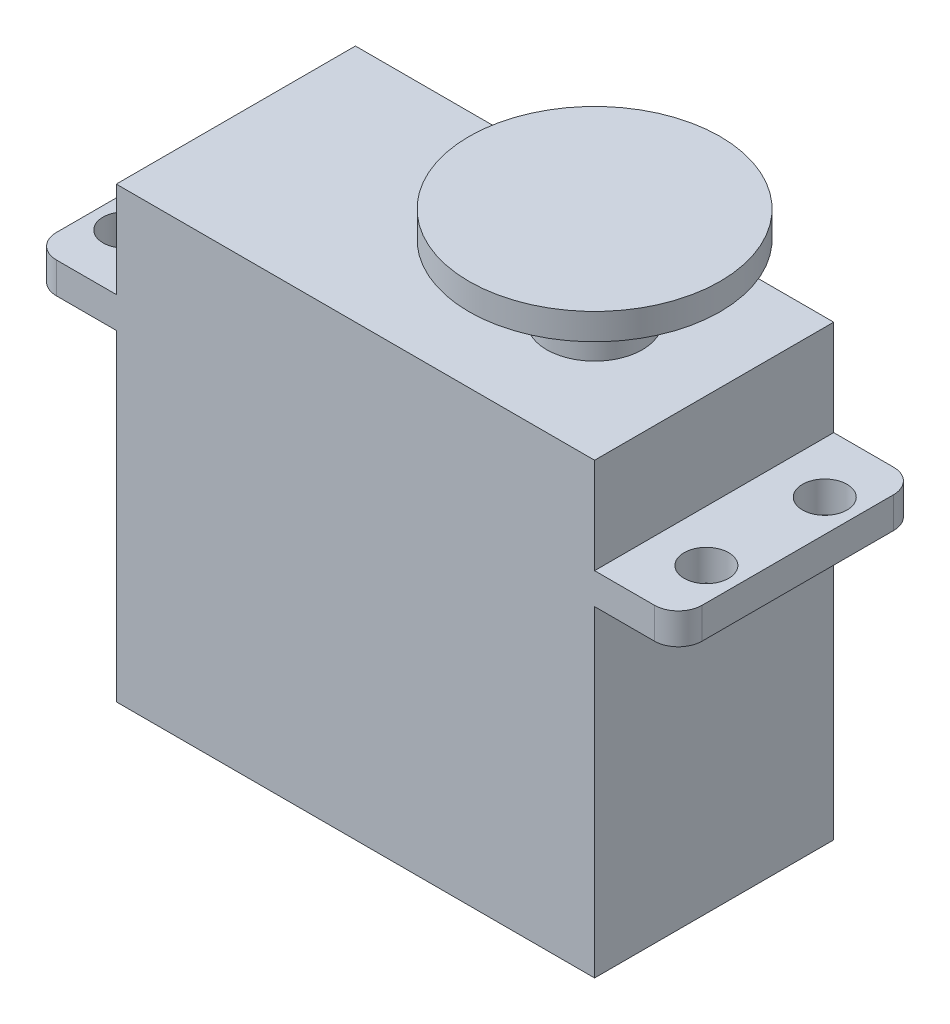
ISO-10303-21;
HEADER;
FILE_DESCRIPTION(('STEP AP214'),'2;1');
FILE_NAME('part.step','',(''),(''),'','','');
FILE_SCHEMA(('AUTOMOTIVE_DESIGN { 1 0 10303 214 1 1 1 1 }'));
ENDSEC;
DATA;
#1=APPLICATION_CONTEXT('core data for automotive mechanical design processes');
#2=APPLICATION_PROTOCOL_DEFINITION('international standard','automotive_design',2000,#1);
#3=PRODUCT_CONTEXT('',#1,'mechanical');
#4=PRODUCT('Part','Part','',(#3));
#5=PRODUCT_RELATED_PRODUCT_CATEGORY('part','',(#4));
#6=PRODUCT_DEFINITION_FORMATION('','',#4);
#7=PRODUCT_DEFINITION_CONTEXT('part definition',#1,'design');
#8=PRODUCT_DEFINITION('design','',#6,#7);
#9=PRODUCT_DEFINITION_SHAPE('','',#8);
#10=(LENGTH_UNIT() NAMED_UNIT(*) SI_UNIT(.MILLI.,.METRE.));
#11=(NAMED_UNIT(*) PLANE_ANGLE_UNIT() SI_UNIT($,.RADIAN.));
#12=(NAMED_UNIT(*) SI_UNIT($,.STERADIAN.) SOLID_ANGLE_UNIT());
#13=UNCERTAINTY_MEASURE_WITH_UNIT(LENGTH_MEASURE(1.E-05),#10,'distance_accuracy_value','');
#14=(GEOMETRIC_REPRESENTATION_CONTEXT(3) GLOBAL_UNCERTAINTY_ASSIGNED_CONTEXT((#13)) GLOBAL_UNIT_ASSIGNED_CONTEXT((#10,
#11,#12)) REPRESENTATION_CONTEXT('',''));
#15=CARTESIAN_POINT('',(0.,0.,0.));
#16=DIRECTION('',(0.,0.,1.));
#17=DIRECTION('',(1.,0.,0.));
#18=AXIS2_PLACEMENT_3D('',#15,#16,#17);
#19=CARTESIAN_POINT('',(15.,2.6,-8.));
#20=DIRECTION('',(0.,-1.,0.));
#21=DIRECTION('',(0.,0.,-1.));
#22=AXIS2_PLACEMENT_3D('',#19,#20,#21);
#23=PLANE('',#22);
#24=CARTESIAN_POINT('',(14.3,2.6,-4.95));
#25=DIRECTION('',(0.,1.,0.));
#26=DIRECTION('',(0.,0.,1.));
#27=AXIS2_PLACEMENT_3D('',#24,#25,#26);
#28=CIRCLE('',#27,1.86378934614785);
#29=CARTESIAN_POINT('',(14.3,2.6,-3.08621065385215));
#30=VERTEX_POINT('',#29);
#31=EDGE_CURVE('E172',#30,#30,#28,.T.);
#32=ORIENTED_EDGE('',*,*,#31,.F.);
#33=EDGE_LOOP('',(#32));
#34=FACE_BOUND('',#33,.T.);
#35=CARTESIAN_POINT('',(14.3,2.6,4.95));
#36=DIRECTION('',(0.,1.,0.));
#37=DIRECTION('',(0.,0.,1.));
#38=AXIS2_PLACEMENT_3D('',#35,#36,#37);
#39=CIRCLE('',#38,1.86378934614785);
#40=CARTESIAN_POINT('',(14.3,2.6,6.81378934614785));
#41=VERTEX_POINT('',#40);
#42=EDGE_CURVE('E181',#41,#41,#39,.T.);
#43=ORIENTED_EDGE('',*,*,#42,.F.);
#44=EDGE_LOOP('',(#43));
#45=FACE_BOUND('',#44,.T.);
#46=DIRECTION('',(0.,0.,-1.));
#47=VECTOR('',#46,1.);
#48=CARTESIAN_POINT('',(10.,2.6,-10.));
#49=LINE('',#48,#47);
#50=CARTESIAN_POINT('',(9.99999999999999,2.6,10.));
#51=VERTEX_POINT('',#50);
#52=CARTESIAN_POINT('',(9.99999999999999,2.6,-10.));
#53=VERTEX_POINT('',#52);
#54=EDGE_CURVE('E51',#51,#53,#49,.T.);
#55=ORIENTED_EDGE('',*,*,#54,.F.);
#56=DIRECTION('',(1.,0.,0.));
#57=VECTOR('',#56,1.);
#58=CARTESIAN_POINT('',(-35.,2.6,10.));
#59=LINE('',#58,#57);
#60=CARTESIAN_POINT('',(15.,2.6,10.));
#61=VERTEX_POINT('',#60);
#62=EDGE_CURVE('E212',#51,#61,#59,.T.);
#63=ORIENTED_EDGE('',*,*,#62,.T.);
#64=CARTESIAN_POINT('',(15.,2.6,8.));
#65=DIRECTION('',(0.,1.,0.));
#66=DIRECTION('',(0.,0.,-1.));
#67=AXIS2_PLACEMENT_3D('',#64,#65,#66);
#68=CIRCLE('',#67,2.);
#69=CARTESIAN_POINT('',(17.,2.6,7.99999999999998));
#70=VERTEX_POINT('',#69);
#71=EDGE_CURVE('E215',#61,#70,#68,.T.);
#72=ORIENTED_EDGE('',*,*,#71,.T.);
#73=DIRECTION('',(0.,0.,-1.));
#74=VECTOR('',#73,1.);
#75=CARTESIAN_POINT('',(17.,2.6,7.99999999999998));
#76=LINE('',#75,#74);
#77=CARTESIAN_POINT('',(17.,2.6,-7.99999999999999));
#78=VERTEX_POINT('',#77);
#79=EDGE_CURVE('E217',#70,#78,#76,.T.);
#80=ORIENTED_EDGE('',*,*,#79,.T.);
#81=CARTESIAN_POINT('',(15.,2.6,-8.));
#82=DIRECTION('',(0.,1.,0.));
#83=DIRECTION('',(0.,0.,-1.));
#84=AXIS2_PLACEMENT_3D('',#81,#82,#83);
#85=CIRCLE('',#84,2.);
#86=CARTESIAN_POINT('',(15.,2.6,-10.));
#87=VERTEX_POINT('',#86);
#88=EDGE_CURVE('E199',#78,#87,#85,.T.);
#89=ORIENTED_EDGE('',*,*,#88,.T.);
#90=DIRECTION('',(-1.,0.,0.));
#91=VECTOR('',#90,1.);
#92=CARTESIAN_POINT('',(-35.,2.6,-10.));
#93=LINE('',#92,#91);
#94=EDGE_CURVE('E204',#87,#53,#93,.T.);
#95=ORIENTED_EDGE('',*,*,#94,.T.);
#96=EDGE_LOOP('',(#55,#63,#72,#80,#89,#95));
#97=FACE_BOUND('',#96,.T.);
#98=ADVANCED_FACE('F34',(#34,#45,#97),#23,.F.);
#99=CARTESIAN_POINT('',(-34.3,2.6,-4.95));
#100=DIRECTION('',(0.,1.,0.));
#101=DIRECTION('',(0.,0.,1.));
#102=AXIS2_PLACEMENT_3D('',#99,#100,#101);
#103=CIRCLE('',#102,1.86378934614785);
#104=CARTESIAN_POINT('',(-34.3,2.6,-3.08621065385215));
#105=VERTEX_POINT('',#104);
#106=EDGE_CURVE('E187',#105,#105,#103,.T.);
#107=ORIENTED_EDGE('',*,*,#106,.F.);
#108=EDGE_LOOP('',(#107));
#109=FACE_BOUND('',#108,.T.);
#110=CARTESIAN_POINT('',(-34.3,2.6,4.95));
#111=DIRECTION('',(0.,1.,0.));
#112=DIRECTION('',(0.,0.,1.));
#113=AXIS2_PLACEMENT_3D('',#110,#111,#112);
#114=CIRCLE('',#113,1.86378934614785);
#115=CARTESIAN_POINT('',(-34.3,2.6,6.81378934614785));
#116=VERTEX_POINT('',#115);
#117=EDGE_CURVE('E193',#116,#116,#114,.T.);
#118=ORIENTED_EDGE('',*,*,#117,.F.);
#119=EDGE_LOOP('',(#118));
#120=FACE_BOUND('',#119,.T.);
#121=DIRECTION('',(0.,0.,1.));
#122=VECTOR('',#121,1.);
#123=CARTESIAN_POINT('',(-30.,2.6,-10.));
#124=LINE('',#123,#122);
#125=CARTESIAN_POINT('',(-30.,2.6,-10.));
#126=VERTEX_POINT('',#125);
#127=CARTESIAN_POINT('',(-30.,2.6,10.));
#128=VERTEX_POINT('',#127);
#129=EDGE_CURVE('E59',#126,#128,#124,.T.);
#130=ORIENTED_EDGE('',*,*,#129,.F.);
#131=CARTESIAN_POINT('',(-35.,2.6,-10.));
#132=VERTEX_POINT('',#131);
#133=EDGE_CURVE('E202',#126,#132,#93,.T.);
#134=ORIENTED_EDGE('',*,*,#133,.T.);
#135=CARTESIAN_POINT('',(-35.,2.6,-8.));
#136=DIRECTION('',(0.,1.,0.));
#137=DIRECTION('',(0.,0.,1.));
#138=AXIS2_PLACEMENT_3D('',#135,#136,#137);
#139=CIRCLE('',#138,2.);
#140=CARTESIAN_POINT('',(-37.,2.6,-7.99999999999999));
#141=VERTEX_POINT('',#140);
#142=EDGE_CURVE('E206',#132,#141,#139,.T.);
#143=ORIENTED_EDGE('',*,*,#142,.T.);
#144=DIRECTION('',(0.,0.,1.));
#145=VECTOR('',#144,1.);
#146=CARTESIAN_POINT('',(-37.,2.6,7.99999999999998));
#147=LINE('',#146,#145);
#148=CARTESIAN_POINT('',(-37.,2.6,7.99999999999998));
#149=VERTEX_POINT('',#148);
#150=EDGE_CURVE('E208',#141,#149,#147,.T.);
#151=ORIENTED_EDGE('',*,*,#150,.T.);
#152=CARTESIAN_POINT('',(-35.,2.6,8.));
#153=DIRECTION('',(0.,1.,0.));
#154=DIRECTION('',(0.,0.,-1.));
#155=AXIS2_PLACEMENT_3D('',#152,#153,#154);
#156=CIRCLE('',#155,2.);
#157=CARTESIAN_POINT('',(-35.,2.6,10.));
#158=VERTEX_POINT('',#157);
#159=EDGE_CURVE('E210',#149,#158,#156,.T.);
#160=ORIENTED_EDGE('',*,*,#159,.T.);
#161=EDGE_CURVE('E213',#158,#128,#59,.T.);
#162=ORIENTED_EDGE('',*,*,#161,.T.);
#163=EDGE_LOOP('',(#130,#134,#143,#151,#160,#162));
#164=FACE_BOUND('',#163,.T.);
#165=ADVANCED_FACE('F326',(#109,#120,#164),#23,.F.);
#166=CARTESIAN_POINT('',(10.,-26.9,-10.));
#167=DIRECTION('',(1.,0.,0.));
#168=DIRECTION('',(0.,0.,-1.));
#169=AXIS2_PLACEMENT_3D('',#166,#167,#168);
#170=PLANE('',#169);
#171=DIRECTION('',(0.,0.,-1.));
#172=VECTOR('',#171,1.);
#173=CARTESIAN_POINT('',(10.,0.,-10.));
#174=LINE('',#173,#172);
#175=CARTESIAN_POINT('',(10.,0.,10.));
#176=VERTEX_POINT('',#175);
#177=CARTESIAN_POINT('',(10.,0.,-10.));
#178=VERTEX_POINT('',#177);
#179=EDGE_CURVE('E262',#176,#178,#174,.T.);
#180=ORIENTED_EDGE('',*,*,#179,.F.);
#181=DIRECTION('',(0.,1.,0.));
#182=VECTOR('',#181,1.);
#183=CARTESIAN_POINT('',(10.,-26.9,10.));
#184=LINE('',#183,#182);
#185=CARTESIAN_POINT('',(10.,-26.9,10.));
#186=VERTEX_POINT('',#185);
#187=EDGE_CURVE('E11',#186,#176,#184,.T.);
#188=ORIENTED_EDGE('',*,*,#187,.F.);
#189=DIRECTION('',(0.,0.,-1.));
#190=VECTOR('',#189,1.);
#191=CARTESIAN_POINT('',(10.,-26.9,-10.));
#192=LINE('',#191,#190);
#193=CARTESIAN_POINT('',(10.,-26.9,-10.));
#194=VERTEX_POINT('',#193);
#195=EDGE_CURVE('E263',#186,#194,#192,.T.);
#196=ORIENTED_EDGE('',*,*,#195,.T.);
#197=DIRECTION('',(0.,1.,0.));
#198=VECTOR('',#197,1.);
#199=CARTESIAN_POINT('',(10.,-26.9,-10.));
#200=LINE('',#199,#198);
#201=EDGE_CURVE('E38',#194,#178,#200,.T.);
#202=ORIENTED_EDGE('',*,*,#201,.T.);
#203=EDGE_LOOP('',(#180,#188,#196,#202));
#204=FACE_BOUND('',#203,.T.);
#205=ADVANCED_FACE('F36',(#204),#170,.T.);
#206=CARTESIAN_POINT('',(-30.,-26.9,10.));
#207=DIRECTION('',(0.,0.,1.));
#208=DIRECTION('',(1.,0.,0.));
#209=AXIS2_PLACEMENT_3D('',#206,#207,#208);
#210=PLANE('',#209);
#211=ORIENTED_EDGE('',*,*,#187,.T.);
#212=DIRECTION('',(1.,0.,0.));
#213=VECTOR('',#212,1.);
#214=CARTESIAN_POINT('',(-35.,0.,10.));
#215=LINE('',#214,#213);
#216=CARTESIAN_POINT('',(15.,0.,10.));
#217=VERTEX_POINT('',#216);
#218=EDGE_CURVE('E232',#176,#217,#215,.T.);
#219=ORIENTED_EDGE('',*,*,#218,.T.);
#220=DIRECTION('',(0.,-1.,0.));
#221=VECTOR('',#220,1.);
#222=CARTESIAN_POINT('',(15.,2.6,10.));
#223=LINE('',#222,#221);
#224=EDGE_CURVE('E244',#61,#217,#223,.T.);
#225=ORIENTED_EDGE('',*,*,#224,.F.);
#226=ORIENTED_EDGE('',*,*,#62,.F.);
#227=DIRECTION('',(0.,-1.,0.));
#228=VECTOR('',#227,1.);
#229=CARTESIAN_POINT('',(10.,10.6,10.));
#230=LINE('',#229,#228);
#231=CARTESIAN_POINT('',(10.,10.6,10.));
#232=VERTEX_POINT('',#231);
#233=EDGE_CURVE('E333',#232,#51,#230,.T.);
#234=ORIENTED_EDGE('',*,*,#233,.F.);
#235=DIRECTION('',(1.,0.,0.));
#236=VECTOR('',#235,1.);
#237=CARTESIAN_POINT('',(-30.,10.6,10.));
#238=LINE('',#237,#236);
#239=CARTESIAN_POINT('',(-30.,10.6,10.));
#240=VERTEX_POINT('',#239);
#241=EDGE_CURVE('E163',#240,#232,#238,.T.);
#242=ORIENTED_EDGE('',*,*,#241,.F.);
#243=DIRECTION('',(0.,-1.,0.));
#244=VECTOR('',#243,1.);
#245=CARTESIAN_POINT('',(-30.,10.6,10.));
#246=LINE('',#245,#244);
#247=EDGE_CURVE('E174',#240,#128,#246,.T.);
#248=ORIENTED_EDGE('',*,*,#247,.T.);
#249=ORIENTED_EDGE('',*,*,#161,.F.);
#250=DIRECTION('',(0.,-1.,0.));
#251=VECTOR('',#250,1.);
#252=CARTESIAN_POINT('',(-35.,2.6,10.));
#253=LINE('',#252,#251);
#254=CARTESIAN_POINT('',(-35.,0.,10.));
#255=VERTEX_POINT('',#254);
#256=EDGE_CURVE('E247',#158,#255,#253,.T.);
#257=ORIENTED_EDGE('',*,*,#256,.T.);
#258=CARTESIAN_POINT('',(-30.,0.,10.));
#259=VERTEX_POINT('',#258);
#260=EDGE_CURVE('E233',#255,#259,#215,.T.);
#261=ORIENTED_EDGE('',*,*,#260,.T.);
#262=DIRECTION('',(0.,1.,0.));
#263=VECTOR('',#262,1.);
#264=CARTESIAN_POINT('',(-30.,-26.9,10.));
#265=LINE('',#264,#263);
#266=CARTESIAN_POINT('',(-30.,-26.9,10.));
#267=VERTEX_POINT('',#266);
#268=EDGE_CURVE('E43',#267,#259,#265,.T.);
#269=ORIENTED_EDGE('',*,*,#268,.F.);
#270=DIRECTION('',(1.,0.,0.));
#271=VECTOR('',#270,1.);
#272=CARTESIAN_POINT('',(-30.,-26.9,10.));
#273=LINE('',#272,#271);
#274=EDGE_CURVE('E273',#267,#186,#273,.T.);
#275=ORIENTED_EDGE('',*,*,#274,.T.);
#276=EDGE_LOOP('',(#211,#219,#225,#226,#234,#242,#248,#249,#257,#261,#269,#275));
#277=FACE_BOUND('',#276,.T.);
#278=ADVANCED_FACE('F306',(#277),#210,.T.);
#279=CARTESIAN_POINT('',(-30.,-26.9,-10.));
#280=DIRECTION('',(-1.,0.,0.));
#281=DIRECTION('',(0.,0.,1.));
#282=AXIS2_PLACEMENT_3D('',#279,#280,#281);
#283=PLANE('',#282);
#284=DIRECTION('',(0.,0.,1.));
#285=VECTOR('',#284,1.);
#286=CARTESIAN_POINT('',(-30.,0.,-10.));
#287=LINE('',#286,#285);
#288=CARTESIAN_POINT('',(-30.,0.,-10.));
#289=VERTEX_POINT('',#288);
#290=EDGE_CURVE('E267',#289,#259,#287,.T.);
#291=ORIENTED_EDGE('',*,*,#290,.F.);
#292=DIRECTION('',(0.,1.,0.));
#293=VECTOR('',#292,1.);
#294=CARTESIAN_POINT('',(-30.,-26.9,-10.));
#295=LINE('',#294,#293);
#296=CARTESIAN_POINT('',(-30.,-26.9,-10.));
#297=VERTEX_POINT('',#296);
#298=EDGE_CURVE('E280',#297,#289,#295,.T.);
#299=ORIENTED_EDGE('',*,*,#298,.F.);
#300=DIRECTION('',(0.,0.,1.));
#301=VECTOR('',#300,1.);
#302=CARTESIAN_POINT('',(-30.,-26.9,-10.));
#303=LINE('',#302,#301);
#304=EDGE_CURVE('E270',#297,#267,#303,.T.);
#305=ORIENTED_EDGE('',*,*,#304,.T.);
#306=ORIENTED_EDGE('',*,*,#268,.T.);
#307=EDGE_LOOP('',(#291,#299,#305,#306));
#308=FACE_BOUND('',#307,.T.);
#309=ADVANCED_FACE('F312',(#308),#283,.T.);
#310=CARTESIAN_POINT('',(-30.,-26.9,-10.));
#311=DIRECTION('',(0.,0.,-1.));
#312=DIRECTION('',(-1.,0.,0.));
#313=AXIS2_PLACEMENT_3D('',#310,#311,#312);
#314=PLANE('',#313);
#315=ORIENTED_EDGE('',*,*,#298,.T.);
#316=DIRECTION('',(-1.,0.,0.));
#317=VECTOR('',#316,1.);
#318=CARTESIAN_POINT('',(-35.,0.,-10.));
#319=LINE('',#318,#317);
#320=CARTESIAN_POINT('',(-35.,0.,-10.));
#321=VERTEX_POINT('',#320);
#322=EDGE_CURVE('E222',#289,#321,#319,.T.);
#323=ORIENTED_EDGE('',*,*,#322,.T.);
#324=DIRECTION('',(0.,-1.,0.));
#325=VECTOR('',#324,1.);
#326=CARTESIAN_POINT('',(-35.,2.6,-10.));
#327=LINE('',#326,#325);
#328=EDGE_CURVE('E256',#132,#321,#327,.T.);
#329=ORIENTED_EDGE('',*,*,#328,.F.);
#330=ORIENTED_EDGE('',*,*,#133,.F.);
#331=DIRECTION('',(0.,-1.,0.));
#332=VECTOR('',#331,1.);
#333=CARTESIAN_POINT('',(-30.,10.6,-10.));
#334=LINE('',#333,#332);
#335=CARTESIAN_POINT('',(-30.,10.6,-10.));
#336=VERTEX_POINT('',#335);
#337=EDGE_CURVE('E154',#336,#126,#334,.T.);
#338=ORIENTED_EDGE('',*,*,#337,.F.);
#339=DIRECTION('',(-1.,0.,0.));
#340=VECTOR('',#339,1.);
#341=CARTESIAN_POINT('',(-30.,10.6,-10.));
#342=LINE('',#341,#340);
#343=CARTESIAN_POINT('',(10.,10.6,-10.));
#344=VERTEX_POINT('',#343);
#345=EDGE_CURVE('E148',#344,#336,#342,.T.);
#346=ORIENTED_EDGE('',*,*,#345,.F.);
#347=DIRECTION('',(0.,-1.,0.));
#348=VECTOR('',#347,1.);
#349=CARTESIAN_POINT('',(10.,10.6,-10.));
#350=LINE('',#349,#348);
#351=EDGE_CURVE('E152',#344,#53,#350,.T.);
#352=ORIENTED_EDGE('',*,*,#351,.T.);
#353=ORIENTED_EDGE('',*,*,#94,.F.);
#354=DIRECTION('',(0.,-1.,0.));
#355=VECTOR('',#354,1.);
#356=CARTESIAN_POINT('',(15.,2.6,-10.));
#357=LINE('',#356,#355);
#358=CARTESIAN_POINT('',(15.,0.,-10.));
#359=VERTEX_POINT('',#358);
#360=EDGE_CURVE('E259',#87,#359,#357,.T.);
#361=ORIENTED_EDGE('',*,*,#360,.T.);
#362=EDGE_CURVE('E223',#359,#178,#319,.T.);
#363=ORIENTED_EDGE('',*,*,#362,.T.);
#364=ORIENTED_EDGE('',*,*,#201,.F.);
#365=DIRECTION('',(-1.,0.,0.));
#366=VECTOR('',#365,1.);
#367=CARTESIAN_POINT('',(-30.,-26.9,-10.));
#368=LINE('',#367,#366);
#369=EDGE_CURVE('E266',#194,#297,#368,.T.);
#370=ORIENTED_EDGE('',*,*,#369,.T.);
#371=EDGE_LOOP('',(#315,#323,#329,#330,#338,#346,#352,#353,#361,#363,#364,#370));
#372=FACE_BOUND('',#371,.T.);
#373=ADVANCED_FACE('F150',(#372),#314,.T.);
#374=CARTESIAN_POINT('',(0.,-26.9,0.));
#375=DIRECTION('',(0.,1.,0.));
#376=DIRECTION('',(0.,0.,1.));
#377=AXIS2_PLACEMENT_3D('',#374,#375,#376);
#378=PLANE('',#377);
#379=ORIENTED_EDGE('',*,*,#195,.F.);
#380=ORIENTED_EDGE('',*,*,#274,.F.);
#381=ORIENTED_EDGE('',*,*,#304,.F.);
#382=ORIENTED_EDGE('',*,*,#369,.F.);
#383=EDGE_LOOP('',(#379,#380,#381,#382));
#384=FACE_BOUND('',#383,.T.);
#385=ADVANCED_FACE('F309',(#384),#378,.F.);
#386=CARTESIAN_POINT('',(15.,0.,-8.));
#387=DIRECTION('',(0.,-1.,0.));
#388=DIRECTION('',(0.,0.,-1.));
#389=AXIS2_PLACEMENT_3D('',#386,#387,#388);
#390=PLANE('',#389);
#391=CARTESIAN_POINT('',(14.3,0.,-4.95));
#392=DIRECTION('',(0.,1.,0.));
#393=DIRECTION('',(0.,0.,1.));
#394=AXIS2_PLACEMENT_3D('',#391,#392,#393);
#395=CIRCLE('',#394,1.86378934614785);
#396=CARTESIAN_POINT('',(14.3,0.,-3.08621065385215));
#397=VERTEX_POINT('',#396);
#398=EDGE_CURVE('E169',#397,#397,#395,.T.);
#399=ORIENTED_EDGE('',*,*,#398,.T.);
#400=EDGE_LOOP('',(#399));
#401=FACE_BOUND('',#400,.T.);
#402=CARTESIAN_POINT('',(14.3,0.,4.95));
#403=DIRECTION('',(0.,1.,0.));
#404=DIRECTION('',(0.,0.,1.));
#405=AXIS2_PLACEMENT_3D('',#402,#403,#404);
#406=CIRCLE('',#405,1.86378934614785);
#407=CARTESIAN_POINT('',(14.3,0.,6.81378934614785));
#408=VERTEX_POINT('',#407);
#409=EDGE_CURVE('E179',#408,#408,#406,.T.);
#410=ORIENTED_EDGE('',*,*,#409,.T.);
#411=EDGE_LOOP('',(#410));
#412=FACE_BOUND('',#411,.T.);
#413=ORIENTED_EDGE('',*,*,#218,.F.);
#414=ORIENTED_EDGE('',*,*,#179,.T.);
#415=ORIENTED_EDGE('',*,*,#362,.F.);
#416=CARTESIAN_POINT('',(15.,0.,-8.));
#417=DIRECTION('',(0.,1.,0.));
#418=DIRECTION('',(0.,0.,-1.));
#419=AXIS2_PLACEMENT_3D('',#416,#417,#418);
#420=CIRCLE('',#419,2.);
#421=CARTESIAN_POINT('',(17.,0.,-7.99999999999999));
#422=VERTEX_POINT('',#421);
#423=EDGE_CURVE('E196',#422,#359,#420,.T.);
#424=ORIENTED_EDGE('',*,*,#423,.F.);
#425=DIRECTION('',(0.,0.,-1.));
#426=VECTOR('',#425,1.);
#427=CARTESIAN_POINT('',(17.,0.,7.99999999999998));
#428=LINE('',#427,#426);
#429=CARTESIAN_POINT('',(17.,0.,7.99999999999998));
#430=VERTEX_POINT('',#429);
#431=EDGE_CURVE('E203',#430,#422,#428,.T.);
#432=ORIENTED_EDGE('',*,*,#431,.F.);
#433=CARTESIAN_POINT('',(15.,0.,8.));
#434=DIRECTION('',(0.,1.,0.));
#435=DIRECTION('',(0.,0.,-1.));
#436=AXIS2_PLACEMENT_3D('',#433,#434,#435);
#437=CIRCLE('',#436,2.);
#438=EDGE_CURVE('E236',#217,#430,#437,.T.);
#439=ORIENTED_EDGE('',*,*,#438,.F.);
#440=EDGE_LOOP('',(#413,#414,#415,#424,#432,#439));
#441=FACE_BOUND('',#440,.T.);
#442=ADVANCED_FACE('F288',(#401,#412,#441),#390,.T.);
#443=CARTESIAN_POINT('',(-34.3,0.,4.95));
#444=DIRECTION('',(0.,1.,0.));
#445=DIRECTION('',(0.,0.,1.));
#446=AXIS2_PLACEMENT_3D('',#443,#444,#445);
#447=CIRCLE('',#446,1.86378934614785);
#448=CARTESIAN_POINT('',(-34.3,0.,6.81378934614785));
#449=VERTEX_POINT('',#448);
#450=EDGE_CURVE('E190',#449,#449,#447,.T.);
#451=ORIENTED_EDGE('',*,*,#450,.T.);
#452=EDGE_LOOP('',(#451));
#453=FACE_BOUND('',#452,.T.);
#454=ORIENTED_EDGE('',*,*,#322,.F.);
#455=ORIENTED_EDGE('',*,*,#290,.T.);
#456=ORIENTED_EDGE('',*,*,#260,.F.);
#457=CARTESIAN_POINT('',(-35.,0.,8.));
#458=DIRECTION('',(0.,1.,0.));
#459=DIRECTION('',(0.,0.,-1.));
#460=AXIS2_PLACEMENT_3D('',#457,#458,#459);
#461=CIRCLE('',#460,2.);
#462=CARTESIAN_POINT('',(-37.,0.,7.99999999999998));
#463=VERTEX_POINT('',#462);
#464=EDGE_CURVE('E230',#463,#255,#461,.T.);
#465=ORIENTED_EDGE('',*,*,#464,.F.);
#466=DIRECTION('',(0.,0.,1.));
#467=VECTOR('',#466,1.);
#468=CARTESIAN_POINT('',(-37.,0.,7.99999999999998));
#469=LINE('',#468,#467);
#470=CARTESIAN_POINT('',(-37.,0.,-7.99999999999999));
#471=VERTEX_POINT('',#470);
#472=EDGE_CURVE('E228',#471,#463,#469,.T.);
#473=ORIENTED_EDGE('',*,*,#472,.F.);
#474=CARTESIAN_POINT('',(-35.,0.,-8.));
#475=DIRECTION('',(0.,1.,0.));
#476=DIRECTION('',(0.,0.,1.));
#477=AXIS2_PLACEMENT_3D('',#474,#475,#476);
#478=CIRCLE('',#477,2.);
#479=EDGE_CURVE('E226',#321,#471,#478,.T.);
#480=ORIENTED_EDGE('',*,*,#479,.F.);
#481=EDGE_LOOP('',(#454,#455,#456,#465,#473,#480));
#482=FACE_BOUND('',#481,.T.);
#483=CARTESIAN_POINT('',(-34.3,0.,-4.95));
#484=DIRECTION('',(0.,1.,0.));
#485=DIRECTION('',(0.,0.,1.));
#486=AXIS2_PLACEMENT_3D('',#483,#484,#485);
#487=CIRCLE('',#486,1.86378934614785);
#488=CARTESIAN_POINT('',(-34.3,0.,-3.08621065385215));
#489=VERTEX_POINT('',#488);
#490=EDGE_CURVE('E184',#489,#489,#487,.T.);
#491=ORIENTED_EDGE('',*,*,#490,.T.);
#492=EDGE_LOOP('',(#491));
#493=FACE_BOUND('',#492,.T.);
#494=ADVANCED_FACE('F317',(#453,#482,#493),#390,.T.);
#495=CARTESIAN_POINT('',(15.,2.6,-8.));
#496=DIRECTION('',(0.,-1.,0.));
#497=DIRECTION('',(0.,0.,-1.));
#498=AXIS2_PLACEMENT_3D('',#495,#496,#497);
#499=CYLINDRICAL_SURFACE('',#498,2.);
#500=ORIENTED_EDGE('',*,*,#423,.T.);
#501=ORIENTED_EDGE('',*,*,#360,.F.);
#502=ORIENTED_EDGE('',*,*,#88,.F.);
#503=DIRECTION('',(0.,-1.,0.));
#504=VECTOR('',#503,1.);
#505=CARTESIAN_POINT('',(17.,2.6,-7.99999999999999));
#506=LINE('',#505,#504);
#507=EDGE_CURVE('E219',#78,#422,#506,.T.);
#508=ORIENTED_EDGE('',*,*,#507,.T.);
#509=EDGE_LOOP('',(#500,#501,#502,#508));
#510=FACE_BOUND('',#509,.T.);
#511=ADVANCED_FACE('F294',(#510),#499,.T.);
#512=CARTESIAN_POINT('',(-35.,2.6,-8.));
#513=DIRECTION('',(0.,-1.,0.));
#514=DIRECTION('',(0.,0.,-1.));
#515=AXIS2_PLACEMENT_3D('',#512,#513,#514);
#516=CYLINDRICAL_SURFACE('',#515,2.);
#517=ORIENTED_EDGE('',*,*,#479,.T.);
#518=DIRECTION('',(0.,-1.,0.));
#519=VECTOR('',#518,1.);
#520=CARTESIAN_POINT('',(-37.,2.6,-7.99999999999999));
#521=LINE('',#520,#519);
#522=EDGE_CURVE('E253',#141,#471,#521,.T.);
#523=ORIENTED_EDGE('',*,*,#522,.F.);
#524=ORIENTED_EDGE('',*,*,#142,.F.);
#525=ORIENTED_EDGE('',*,*,#328,.T.);
#526=EDGE_LOOP('',(#517,#523,#524,#525));
#527=FACE_BOUND('',#526,.T.);
#528=ADVANCED_FACE('F323',(#527),#516,.T.);
#529=CARTESIAN_POINT('',(-37.,2.6,7.99999999999998));
#530=DIRECTION('',(1.,0.,0.));
#531=DIRECTION('',(0.,0.,-1.));
#532=AXIS2_PLACEMENT_3D('',#529,#530,#531);
#533=PLANE('',#532);
#534=ORIENTED_EDGE('',*,*,#472,.T.);
#535=DIRECTION('',(0.,-1.,0.));
#536=VECTOR('',#535,1.);
#537=CARTESIAN_POINT('',(-37.,2.6,7.99999999999998));
#538=LINE('',#537,#536);
#539=EDGE_CURVE('E250',#149,#463,#538,.T.);
#540=ORIENTED_EDGE('',*,*,#539,.F.);
#541=ORIENTED_EDGE('',*,*,#150,.F.);
#542=ORIENTED_EDGE('',*,*,#522,.T.);
#543=EDGE_LOOP('',(#534,#540,#541,#542));
#544=FACE_BOUND('',#543,.T.);
#545=ADVANCED_FACE('F346',(#544),#533,.F.);
#546=CARTESIAN_POINT('',(-35.,2.6,8.));
#547=DIRECTION('',(0.,-1.,0.));
#548=DIRECTION('',(0.,0.,-1.));
#549=AXIS2_PLACEMENT_3D('',#546,#547,#548);
#550=CYLINDRICAL_SURFACE('',#549,2.);
#551=ORIENTED_EDGE('',*,*,#464,.T.);
#552=ORIENTED_EDGE('',*,*,#256,.F.);
#553=ORIENTED_EDGE('',*,*,#159,.F.);
#554=ORIENTED_EDGE('',*,*,#539,.T.);
#555=EDGE_LOOP('',(#551,#552,#553,#554));
#556=FACE_BOUND('',#555,.T.);
#557=ADVANCED_FACE('F343',(#556),#550,.T.);
#558=CARTESIAN_POINT('',(15.,2.6,8.));
#559=DIRECTION('',(0.,-1.,0.));
#560=DIRECTION('',(0.,0.,-1.));
#561=AXIS2_PLACEMENT_3D('',#558,#559,#560);
#562=CYLINDRICAL_SURFACE('',#561,2.);
#563=ORIENTED_EDGE('',*,*,#438,.T.);
#564=DIRECTION('',(0.,-1.,0.));
#565=VECTOR('',#564,1.);
#566=CARTESIAN_POINT('',(17.,2.6,7.99999999999998));
#567=LINE('',#566,#565);
#568=EDGE_CURVE('E241',#70,#430,#567,.T.);
#569=ORIENTED_EDGE('',*,*,#568,.F.);
#570=ORIENTED_EDGE('',*,*,#71,.F.);
#571=ORIENTED_EDGE('',*,*,#224,.T.);
#572=EDGE_LOOP('',(#563,#569,#570,#571));
#573=FACE_BOUND('',#572,.T.);
#574=ADVANCED_FACE('F303',(#573),#562,.T.);
#575=CARTESIAN_POINT('',(17.,2.6,7.99999999999998));
#576=DIRECTION('',(-1.,0.,0.));
#577=DIRECTION('',(0.,0.,1.));
#578=AXIS2_PLACEMENT_3D('',#575,#576,#577);
#579=PLANE('',#578);
#580=ORIENTED_EDGE('',*,*,#431,.T.);
#581=ORIENTED_EDGE('',*,*,#507,.F.);
#582=ORIENTED_EDGE('',*,*,#79,.F.);
#583=ORIENTED_EDGE('',*,*,#568,.T.);
#584=EDGE_LOOP('',(#580,#581,#582,#583));
#585=FACE_BOUND('',#584,.T.);
#586=ADVANCED_FACE('F298',(#585),#579,.F.);
#587=CARTESIAN_POINT('',(-34.3,2.6,4.95));
#588=DIRECTION('',(0.,-1.,0.));
#589=DIRECTION('',(0.,0.,-1.));
#590=AXIS2_PLACEMENT_3D('',#587,#588,#589);
#591=CYLINDRICAL_SURFACE('',#590,1.86378934614785);
#592=ORIENTED_EDGE('',*,*,#117,.T.);
#593=EDGE_LOOP('',(#592));
#594=FACE_BOUND('',#593,.T.);
#595=ORIENTED_EDGE('',*,*,#450,.F.);
#596=EDGE_LOOP('',(#595));
#597=FACE_BOUND('',#596,.T.);
#598=ADVANCED_FACE('F366',(#594,#597),#591,.F.);
#599=CARTESIAN_POINT('',(-34.3,2.6,-4.95));
#600=DIRECTION('',(0.,-1.,0.));
#601=DIRECTION('',(0.,0.,-1.));
#602=AXIS2_PLACEMENT_3D('',#599,#600,#601);
#603=CYLINDRICAL_SURFACE('',#602,1.86378934614785);
#604=ORIENTED_EDGE('',*,*,#106,.T.);
#605=EDGE_LOOP('',(#604));
#606=FACE_BOUND('',#605,.T.);
#607=ORIENTED_EDGE('',*,*,#490,.F.);
#608=EDGE_LOOP('',(#607));
#609=FACE_BOUND('',#608,.T.);
#610=ADVANCED_FACE('F388',(#606,#609),#603,.F.);
#611=CARTESIAN_POINT('',(14.3,2.6,4.95));
#612=DIRECTION('',(0.,-1.,0.));
#613=DIRECTION('',(0.,0.,-1.));
#614=AXIS2_PLACEMENT_3D('',#611,#612,#613);
#615=CYLINDRICAL_SURFACE('',#614,1.86378934614785);
#616=ORIENTED_EDGE('',*,*,#42,.T.);
#617=EDGE_LOOP('',(#616));
#618=FACE_BOUND('',#617,.T.);
#619=ORIENTED_EDGE('',*,*,#409,.F.);
#620=EDGE_LOOP('',(#619));
#621=FACE_BOUND('',#620,.T.);
#622=ADVANCED_FACE('F395',(#618,#621),#615,.F.);
#623=CARTESIAN_POINT('',(14.3,2.6,-4.95));
#624=DIRECTION('',(0.,-1.,0.));
#625=DIRECTION('',(0.,0.,-1.));
#626=AXIS2_PLACEMENT_3D('',#623,#624,#625);
#627=CYLINDRICAL_SURFACE('',#626,1.86378934614785);
#628=ORIENTED_EDGE('',*,*,#31,.T.);
#629=EDGE_LOOP('',(#628));
#630=FACE_BOUND('',#629,.T.);
#631=ORIENTED_EDGE('',*,*,#398,.F.);
#632=EDGE_LOOP('',(#631));
#633=FACE_BOUND('',#632,.T.);
#634=ADVANCED_FACE('F402',(#630,#633),#627,.F.);
#635=CARTESIAN_POINT('',(10.,10.6,-10.));
#636=DIRECTION('',(-1.,0.,0.));
#637=DIRECTION('',(0.,0.,1.));
#638=AXIS2_PLACEMENT_3D('',#635,#636,#637);
#639=PLANE('',#638);
#640=ORIENTED_EDGE('',*,*,#54,.T.);
#641=ORIENTED_EDGE('',*,*,#351,.F.);
#642=DIRECTION('',(0.,0.,-1.));
#643=VECTOR('',#642,1.);
#644=CARTESIAN_POINT('',(10.,10.6,-10.));
#645=LINE('',#644,#643);
#646=EDGE_CURVE('E158',#232,#344,#645,.T.);
#647=ORIENTED_EDGE('',*,*,#646,.F.);
#648=ORIENTED_EDGE('',*,*,#233,.T.);
#649=EDGE_LOOP('',(#640,#641,#647,#648));
#650=FACE_BOUND('',#649,.T.);
#651=ADVANCED_FACE('F168',(#650),#639,.F.);
#652=CARTESIAN_POINT('',(-30.,10.6,-10.));
#653=DIRECTION('',(1.,0.,0.));
#654=DIRECTION('',(0.,0.,-1.));
#655=AXIS2_PLACEMENT_3D('',#652,#653,#654);
#656=PLANE('',#655);
#657=ORIENTED_EDGE('',*,*,#129,.T.);
#658=ORIENTED_EDGE('',*,*,#247,.F.);
#659=DIRECTION('',(0.,0.,1.));
#660=VECTOR('',#659,1.);
#661=CARTESIAN_POINT('',(-30.,10.6,-10.));
#662=LINE('',#661,#660);
#663=EDGE_CURVE('E157',#336,#240,#662,.T.);
#664=ORIENTED_EDGE('',*,*,#663,.F.);
#665=ORIENTED_EDGE('',*,*,#337,.T.);
#666=EDGE_LOOP('',(#657,#658,#664,#665));
#667=FACE_BOUND('',#666,.T.);
#668=ADVANCED_FACE('F329',(#667),#656,.F.);
#669=CARTESIAN_POINT('',(0.,10.6,0.));
#670=DIRECTION('',(0.,1.,0.));
#671=DIRECTION('',(0.,0.,1.));
#672=AXIS2_PLACEMENT_3D('',#669,#670,#671);
#673=PLANE('',#672);
#674=CARTESIAN_POINT('',(0.,10.6,0.));
#675=DIRECTION('',(0.,1.,0.));
#676=DIRECTION('',(0.,0.,1.));
#677=AXIS2_PLACEMENT_3D('',#674,#675,#676);
#678=CIRCLE('',#677,4.);
#679=CARTESIAN_POINT('',(0.,10.6,4.));
#680=VERTEX_POINT('',#679);
#681=EDGE_CURVE('E601',#680,#680,#678,.T.);
#682=ORIENTED_EDGE('',*,*,#681,.F.);
#683=EDGE_LOOP('',(#682));
#684=FACE_BOUND('',#683,.T.);
#685=ORIENTED_EDGE('',*,*,#646,.T.);
#686=ORIENTED_EDGE('',*,*,#345,.T.);
#687=ORIENTED_EDGE('',*,*,#663,.T.);
#688=ORIENTED_EDGE('',*,*,#241,.T.);
#689=EDGE_LOOP('',(#685,#686,#687,#688));
#690=FACE_BOUND('',#689,.T.);
#691=ADVANCED_FACE('F161',(#684,#690),#673,.T.);
#692=CARTESIAN_POINT('',(0.,16.6,0.));
#693=DIRECTION('',(0.,-1.,0.));
#694=DIRECTION('',(0.,0.,-1.));
#695=AXIS2_PLACEMENT_3D('',#692,#693,#694);
#696=CYLINDRICAL_SURFACE('',#695,4.);
#697=CARTESIAN_POINT('',(0.,16.6,0.));
#698=DIRECTION('',(0.,1.,0.));
#699=DIRECTION('',(0.,0.,1.));
#700=AXIS2_PLACEMENT_3D('',#697,#698,#699);
#701=CIRCLE('',#700,4.);
#702=CARTESIAN_POINT('',(0.,16.6,4.));
#703=VERTEX_POINT('',#702);
#704=EDGE_CURVE('E337',#703,#703,#701,.T.);
#705=ORIENTED_EDGE('',*,*,#704,.F.);
#706=EDGE_LOOP('',(#705));
#707=FACE_BOUND('',#706,.T.);
#708=ORIENTED_EDGE('',*,*,#681,.T.);
#709=EDGE_LOOP('',(#708));
#710=FACE_BOUND('',#709,.T.);
#711=ADVANCED_FACE('F430',(#707,#710),#696,.T.);
#712=CARTESIAN_POINT('',(0.,18.8,0.));
#713=DIRECTION('',(0.,-1.,0.));
#714=DIRECTION('',(0.,0.,-1.));
#715=AXIS2_PLACEMENT_3D('',#712,#713,#714);
#716=CYLINDRICAL_SURFACE('',#715,10.5);
#717=CARTESIAN_POINT('',(0.,18.8,0.));
#718=DIRECTION('',(0.,1.,0.));
#719=DIRECTION('',(0.,0.,1.));
#720=AXIS2_PLACEMENT_3D('',#717,#718,#719);
#721=CIRCLE('',#720,10.5);
#722=CARTESIAN_POINT('',(0.,18.8,10.5));
#723=VERTEX_POINT('',#722);
#724=EDGE_CURVE('E598',#723,#723,#721,.T.);
#725=ORIENTED_EDGE('',*,*,#724,.F.);
#726=EDGE_LOOP('',(#725));
#727=FACE_BOUND('',#726,.T.);
#728=CARTESIAN_POINT('',(0.,16.6,0.));
#729=DIRECTION('',(0.,1.,0.));
#730=DIRECTION('',(0.,0.,1.));
#731=AXIS2_PLACEMENT_3D('',#728,#729,#730);
#732=CIRCLE('',#731,10.5);
#733=CARTESIAN_POINT('',(0.,16.6,10.5));
#734=VERTEX_POINT('',#733);
#735=EDGE_CURVE('E596',#734,#734,#732,.T.);
#736=ORIENTED_EDGE('',*,*,#735,.T.);
#737=EDGE_LOOP('',(#736));
#738=FACE_BOUND('',#737,.T.);
#739=ADVANCED_FACE('F438',(#727,#738),#716,.T.);
#740=CARTESIAN_POINT('',(0.,18.8,0.));
#741=DIRECTION('',(0.,1.,0.));
#742=DIRECTION('',(0.,0.,1.));
#743=AXIS2_PLACEMENT_3D('',#740,#741,#742);
#744=PLANE('',#743);
#745=ORIENTED_EDGE('',*,*,#724,.T.);
#746=EDGE_LOOP('',(#745));
#747=FACE_BOUND('',#746,.T.);
#748=ADVANCED_FACE('F446',(#747),#744,.T.);
#749=CARTESIAN_POINT('',(0.,16.6,0.));
#750=DIRECTION('',(0.,1.,0.));
#751=DIRECTION('',(0.,0.,1.));
#752=AXIS2_PLACEMENT_3D('',#749,#750,#751);
#753=PLANE('',#752);
#754=ORIENTED_EDGE('',*,*,#704,.T.);
#755=EDGE_LOOP('',(#754));
#756=FACE_BOUND('',#755,.T.);
#757=ORIENTED_EDGE('',*,*,#735,.F.);
#758=EDGE_LOOP('',(#757));
#759=FACE_BOUND('',#758,.T.);
#760=ADVANCED_FACE('F454',(#756,#759),#753,.F.);
#761=CLOSED_SHELL('',(#98,#165,#205,#278,#309,#373,#385,#442,#494,#511,#528,#545,#557,#574,#586,
#598,#610,#622,#634,#651,#668,#691,#711,#739,#748,#760));
#762=MANIFOLD_SOLID_BREP('B2',#761);
#763=ADVANCED_BREP_SHAPE_REPRESENTATION('',(#18,#762),#14);
#764=SHAPE_DEFINITION_REPRESENTATION(#9,#763);
ENDSEC;
END-ISO-10303-21;
